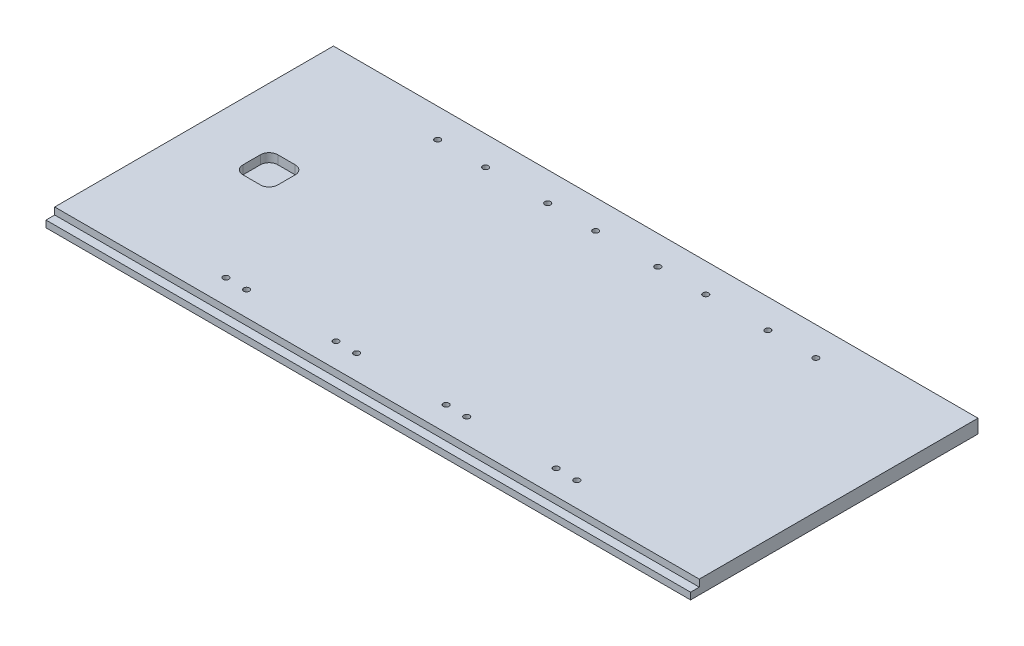
ISO-10303-21;
HEADER;
FILE_DESCRIPTION(('STEP AP214'),'2;1');
FILE_NAME('part.step','',(''),(''),'','','');
FILE_SCHEMA(('AUTOMOTIVE_DESIGN { 1 0 10303 214 1 1 1 1 }'));
ENDSEC;
DATA;
#1=APPLICATION_CONTEXT('core data for automotive mechanical design processes');
#2=APPLICATION_PROTOCOL_DEFINITION('international standard','automotive_design',2000,#1);
#3=PRODUCT_CONTEXT('',#1,'mechanical');
#4=PRODUCT('Part','Part','',(#3));
#5=PRODUCT_RELATED_PRODUCT_CATEGORY('part','',(#4));
#6=PRODUCT_DEFINITION_FORMATION('','',#4);
#7=PRODUCT_DEFINITION_CONTEXT('part definition',#1,'design');
#8=PRODUCT_DEFINITION('design','',#6,#7);
#9=PRODUCT_DEFINITION_SHAPE('','',#8);
#10=(LENGTH_UNIT() NAMED_UNIT(*) SI_UNIT(.MILLI.,.METRE.));
#11=(NAMED_UNIT(*) PLANE_ANGLE_UNIT() SI_UNIT($,.RADIAN.));
#12=(NAMED_UNIT(*) SI_UNIT($,.STERADIAN.) SOLID_ANGLE_UNIT());
#13=UNCERTAINTY_MEASURE_WITH_UNIT(LENGTH_MEASURE(1.E-05),#10,'distance_accuracy_value','');
#14=(GEOMETRIC_REPRESENTATION_CONTEXT(3) GLOBAL_UNCERTAINTY_ASSIGNED_CONTEXT((#13)) GLOBAL_UNIT_ASSIGNED_CONTEXT((#10,
#11,#12)) REPRESENTATION_CONTEXT('',''));
#15=CARTESIAN_POINT('',(0.,0.,0.));
#16=DIRECTION('',(0.,0.,1.));
#17=DIRECTION('',(1.,0.,0.));
#18=AXIS2_PLACEMENT_3D('',#15,#16,#17);
#19=CARTESIAN_POINT('',(-234.95,10.,104.775));
#20=DIRECTION('',(1.,0.,0.));
#21=DIRECTION('',(0.,0.,-1.));
#22=AXIS2_PLACEMENT_3D('',#19,#20,#21);
#23=PLANE('',#22);
#24=DIRECTION('',(0.,-1.,0.));
#25=VECTOR('',#24,1.);
#26=CARTESIAN_POINT('',(-234.95,10.,104.775));
#27=LINE('',#26,#25);
#28=CARTESIAN_POINT('',(-234.95,4.92,104.775));
#29=VERTEX_POINT('',#28);
#30=CARTESIAN_POINT('',(-234.95,0.,104.775));
#31=VERTEX_POINT('',#30);
#32=EDGE_CURVE('E191',#29,#31,#27,.T.);
#33=ORIENTED_EDGE('',*,*,#32,.F.);
#34=DIRECTION('',(0.,0.,1.));
#35=VECTOR('',#34,1.);
#36=CARTESIAN_POINT('',(-234.95,4.92,104.775));
#37=LINE('',#36,#35);
#38=CARTESIAN_POINT('',(-234.95,4.92,98.4250000000001));
#39=VERTEX_POINT('',#38);
#40=EDGE_CURVE('E152',#39,#29,#37,.T.);
#41=ORIENTED_EDGE('',*,*,#40,.F.);
#42=DIRECTION('',(0.,-1.,0.));
#43=VECTOR('',#42,1.);
#44=CARTESIAN_POINT('',(-234.95,10.,98.4250000000001));
#45=LINE('',#44,#43);
#46=CARTESIAN_POINT('',(-234.95,10.,98.4250000000001));
#47=VERTEX_POINT('',#46);
#48=EDGE_CURVE('E144',#47,#39,#45,.T.);
#49=ORIENTED_EDGE('',*,*,#48,.F.);
#50=DIRECTION('',(0.,0.,1.));
#51=VECTOR('',#50,1.);
#52=CARTESIAN_POINT('',(-234.95,10.,104.775));
#53=LINE('',#52,#51);
#54=CARTESIAN_POINT('',(-234.95,10.,-104.775));
#55=VERTEX_POINT('',#54);
#56=EDGE_CURVE('E158',#55,#47,#53,.T.);
#57=ORIENTED_EDGE('',*,*,#56,.F.);
#58=DIRECTION('',(0.,-1.,0.));
#59=VECTOR('',#58,1.);
#60=CARTESIAN_POINT('',(-234.95,10.,-104.775));
#61=LINE('',#60,#59);
#62=CARTESIAN_POINT('',(-234.95,0.,-104.775));
#63=VERTEX_POINT('',#62);
#64=EDGE_CURVE('E176',#55,#63,#61,.T.);
#65=ORIENTED_EDGE('',*,*,#64,.T.);
#66=DIRECTION('',(0.,0.,1.));
#67=VECTOR('',#66,1.);
#68=CARTESIAN_POINT('',(-234.95,0.,104.775));
#69=LINE('',#68,#67);
#70=EDGE_CURVE('E177',#63,#31,#69,.T.);
#71=ORIENTED_EDGE('',*,*,#70,.T.);
#72=EDGE_LOOP('',(#33,#41,#49,#57,#65,#71));
#73=FACE_BOUND('',#72,.T.);
#74=ADVANCED_FACE('F41',(#73),#23,.F.);
#75=CARTESIAN_POINT('',(234.95,10.,104.775));
#76=DIRECTION('',(0.,0.,-1.));
#77=DIRECTION('',(-1.,0.,0.));
#78=AXIS2_PLACEMENT_3D('',#75,#76,#77);
#79=PLANE('',#78);
#80=DIRECTION('',(0.,-1.,0.));
#81=VECTOR('',#80,1.);
#82=CARTESIAN_POINT('',(234.95,10.,104.775));
#83=LINE('',#82,#81);
#84=CARTESIAN_POINT('',(234.95,4.92,104.775));
#85=VERTEX_POINT('',#84);
#86=CARTESIAN_POINT('',(234.95,0.,104.775));
#87=VERTEX_POINT('',#86);
#88=EDGE_CURVE('E189',#85,#87,#83,.T.);
#89=ORIENTED_EDGE('',*,*,#88,.F.);
#90=DIRECTION('',(-1.,0.,0.));
#91=VECTOR('',#90,1.);
#92=CARTESIAN_POINT('',(234.951,4.92,104.775));
#93=LINE('',#92,#91);
#94=EDGE_CURVE('E264',#85,#29,#93,.T.);
#95=ORIENTED_EDGE('',*,*,#94,.T.);
#96=ORIENTED_EDGE('',*,*,#32,.T.);
#97=DIRECTION('',(1.,0.,0.));
#98=VECTOR('',#97,1.);
#99=CARTESIAN_POINT('',(234.95,0.,104.775));
#100=LINE('',#99,#98);
#101=EDGE_CURVE('E180',#31,#87,#100,.T.);
#102=ORIENTED_EDGE('',*,*,#101,.T.);
#103=EDGE_LOOP('',(#89,#95,#96,#102));
#104=FACE_BOUND('',#103,.T.);
#105=ADVANCED_FACE('F378',(#104),#79,.F.);
#106=CARTESIAN_POINT('',(234.95,10.,104.775));
#107=DIRECTION('',(-1.,0.,0.));
#108=DIRECTION('',(0.,0.,1.));
#109=AXIS2_PLACEMENT_3D('',#106,#107,#108);
#110=PLANE('',#109);
#111=DIRECTION('',(0.,1.,0.));
#112=VECTOR('',#111,1.);
#113=CARTESIAN_POINT('',(234.95,10.,98.4250000000001));
#114=LINE('',#113,#112);
#115=CARTESIAN_POINT('',(234.95,4.92,98.4250000000001));
#116=VERTEX_POINT('',#115);
#117=CARTESIAN_POINT('',(234.95,10.,98.4250000000001));
#118=VERTEX_POINT('',#117);
#119=EDGE_CURVE('E147',#116,#118,#114,.T.);
#120=ORIENTED_EDGE('',*,*,#119,.F.);
#121=DIRECTION('',(0.,0.,-1.));
#122=VECTOR('',#121,1.);
#123=CARTESIAN_POINT('',(234.95,4.92,104.775));
#124=LINE('',#123,#122);
#125=EDGE_CURVE('E159',#85,#116,#124,.T.);
#126=ORIENTED_EDGE('',*,*,#125,.F.);
#127=ORIENTED_EDGE('',*,*,#88,.T.);
#128=DIRECTION('',(0.,0.,-1.));
#129=VECTOR('',#128,1.);
#130=CARTESIAN_POINT('',(234.95,0.,104.775));
#131=LINE('',#130,#129);
#132=CARTESIAN_POINT('',(234.95,0.,-104.775));
#133=VERTEX_POINT('',#132);
#134=EDGE_CURVE('E169',#87,#133,#131,.T.);
#135=ORIENTED_EDGE('',*,*,#134,.T.);
#136=DIRECTION('',(0.,-1.,0.));
#137=VECTOR('',#136,1.);
#138=CARTESIAN_POINT('',(234.95,10.,-104.775));
#139=LINE('',#138,#137);
#140=CARTESIAN_POINT('',(234.95,10.,-104.775));
#141=VERTEX_POINT('',#140);
#142=EDGE_CURVE('E186',#141,#133,#139,.T.);
#143=ORIENTED_EDGE('',*,*,#142,.F.);
#144=DIRECTION('',(0.,0.,-1.));
#145=VECTOR('',#144,1.);
#146=CARTESIAN_POINT('',(234.95,10.,104.775));
#147=LINE('',#146,#145);
#148=EDGE_CURVE('E165',#118,#141,#147,.T.);
#149=ORIENTED_EDGE('',*,*,#148,.F.);
#150=EDGE_LOOP('',(#120,#126,#127,#135,#143,#149));
#151=FACE_BOUND('',#150,.T.);
#152=ADVANCED_FACE('F373',(#151),#110,.F.);
#153=CARTESIAN_POINT('',(234.95,10.,-104.775));
#154=DIRECTION('',(0.,0.,1.));
#155=DIRECTION('',(1.,0.,0.));
#156=AXIS2_PLACEMENT_3D('',#153,#154,#155);
#157=PLANE('',#156);
#158=DIRECTION('',(-1.,0.,0.));
#159=VECTOR('',#158,1.);
#160=CARTESIAN_POINT('',(234.95,0.,-104.775));
#161=LINE('',#160,#159);
#162=EDGE_CURVE('E166',#133,#63,#161,.T.);
#163=ORIENTED_EDGE('',*,*,#162,.T.);
#164=ORIENTED_EDGE('',*,*,#64,.F.);
#165=DIRECTION('',(-1.,0.,0.));
#166=VECTOR('',#165,1.);
#167=CARTESIAN_POINT('',(234.95,10.,-104.775));
#168=LINE('',#167,#166);
#169=EDGE_CURVE('E163',#141,#55,#168,.T.);
#170=ORIENTED_EDGE('',*,*,#169,.F.);
#171=ORIENTED_EDGE('',*,*,#142,.T.);
#172=EDGE_LOOP('',(#163,#164,#170,#171));
#173=FACE_BOUND('',#172,.T.);
#174=ADVANCED_FACE('F363',(#173),#157,.F.);
#175=CARTESIAN_POINT('',(0.,10.,0.));
#176=DIRECTION('',(0.,1.,0.));
#177=DIRECTION('',(0.,0.,1.));
#178=AXIS2_PLACEMENT_3D('',#175,#176,#177);
#179=PLANE('',#178);
#180=DIRECTION('',(-1.,0.,0.));
#181=VECTOR('',#180,1.);
#182=CARTESIAN_POINT('',(234.951,10.,98.4250000000001));
#183=LINE('',#182,#181);
#184=EDGE_CURVE('E141',#118,#47,#183,.T.);
#185=ORIENTED_EDGE('',*,*,#184,.F.);
#186=ORIENTED_EDGE('',*,*,#148,.T.);
#187=ORIENTED_EDGE('',*,*,#169,.T.);
#188=ORIENTED_EDGE('',*,*,#56,.T.);
#189=EDGE_LOOP('',(#185,#186,#187,#188));
#190=FACE_BOUND('',#189,.T.);
#191=DIRECTION('',(0.,0.,-1.));
#192=VECTOR('',#191,1.);
#193=CARTESIAN_POINT('',(-167.55,10.,-15.8749999999999));
#194=LINE('',#193,#192);
#195=CARTESIAN_POINT('',(-167.55,10.,3.17500000000006));
#196=VERTEX_POINT('',#195);
#197=CARTESIAN_POINT('',(-167.55,10.,-9.52499999999994));
#198=VERTEX_POINT('',#197);
#199=EDGE_CURVE('E261',#196,#198,#194,.T.);
#200=ORIENTED_EDGE('',*,*,#199,.F.);
#201=CARTESIAN_POINT('',(-173.9,10.,3.17500000000006));
#202=DIRECTION('',(0.,1.,0.));
#203=DIRECTION('',(0.,0.,1.));
#204=AXIS2_PLACEMENT_3D('',#201,#202,#203);
#205=CIRCLE('',#204,6.35);
#206=CARTESIAN_POINT('',(-173.9,10.,9.52500000000006));
#207=VERTEX_POINT('',#206);
#208=EDGE_CURVE('E220',#196,#207,#205,.F.);
#209=ORIENTED_EDGE('',*,*,#208,.T.);
#210=DIRECTION('',(1.,0.,0.));
#211=VECTOR('',#210,1.);
#212=CARTESIAN_POINT('',(-192.95,10.,9.52500000000006));
#213=LINE('',#212,#211);
#214=CARTESIAN_POINT('',(-186.6,10.,9.52500000000006));
#215=VERTEX_POINT('',#214);
#216=EDGE_CURVE('E229',#215,#207,#213,.T.);
#217=ORIENTED_EDGE('',*,*,#216,.F.);
#218=CARTESIAN_POINT('',(-186.6,10.,3.17500000000006));
#219=DIRECTION('',(0.,1.,0.));
#220=DIRECTION('',(0.,0.,1.));
#221=AXIS2_PLACEMENT_3D('',#218,#219,#220);
#222=CIRCLE('',#221,6.35);
#223=CARTESIAN_POINT('',(-192.95,10.,3.17500000000006));
#224=VERTEX_POINT('',#223);
#225=EDGE_CURVE('E222',#215,#224,#222,.F.);
#226=ORIENTED_EDGE('',*,*,#225,.T.);
#227=DIRECTION('',(0.,0.,1.));
#228=VECTOR('',#227,1.);
#229=CARTESIAN_POINT('',(-192.95,10.,-15.8749999999999));
#230=LINE('',#229,#228);
#231=CARTESIAN_POINT('',(-192.95,10.,-9.52499999999994));
#232=VERTEX_POINT('',#231);
#233=EDGE_CURVE('E227',#232,#224,#230,.T.);
#234=ORIENTED_EDGE('',*,*,#233,.F.);
#235=CARTESIAN_POINT('',(-186.6,10.,-9.52499999999994));
#236=DIRECTION('',(0.,1.,0.));
#237=DIRECTION('',(0.,0.,1.));
#238=AXIS2_PLACEMENT_3D('',#235,#236,#237);
#239=CIRCLE('',#238,6.35);
#240=CARTESIAN_POINT('',(-186.6,10.,-15.8749999999999));
#241=VERTEX_POINT('',#240);
#242=EDGE_CURVE('E49',#232,#241,#239,.F.);
#243=ORIENTED_EDGE('',*,*,#242,.T.);
#244=DIRECTION('',(-1.,0.,0.));
#245=VECTOR('',#244,1.);
#246=CARTESIAN_POINT('',(-192.95,10.,-15.8749999999999));
#247=LINE('',#246,#245);
#248=CARTESIAN_POINT('',(-173.9,10.,-15.8749999999999));
#249=VERTEX_POINT('',#248);
#250=EDGE_CURVE('E238',#249,#241,#247,.T.);
#251=ORIENTED_EDGE('',*,*,#250,.F.);
#252=CARTESIAN_POINT('',(-173.9,10.,-9.52499999999994));
#253=DIRECTION('',(0.,1.,0.));
#254=DIRECTION('',(0.,0.,1.));
#255=AXIS2_PLACEMENT_3D('',#252,#253,#254);
#256=CIRCLE('',#255,6.35);
#257=EDGE_CURVE('E11',#249,#198,#256,.F.);
#258=ORIENTED_EDGE('',*,*,#257,.T.);
#259=EDGE_LOOP('',(#200,#209,#217,#226,#234,#243,#251,#258));
#260=FACE_BOUND('',#259,.T.);
#261=CARTESIAN_POINT('',(-137.85,10.,-83.65));
#262=DIRECTION('',(0.,1.,0.));
#263=DIRECTION('',(0.,0.,1.));
#264=AXIS2_PLACEMENT_3D('',#261,#262,#263);
#265=CIRCLE('',#264,2.09999999999999);
#266=CARTESIAN_POINT('',(-137.85,10.,-81.55));
#267=VERTEX_POINT('',#266);
#268=EDGE_CURVE('E272',#267,#267,#265,.T.);
#269=ORIENTED_EDGE('',*,*,#268,.F.);
#270=EDGE_LOOP('',(#269));
#271=FACE_BOUND('',#270,.T.);
#272=CARTESIAN_POINT('',(127.9,10.,80.65));
#273=DIRECTION('',(0.,1.,0.));
#274=DIRECTION('',(0.,0.,1.));
#275=AXIS2_PLACEMENT_3D('',#272,#273,#274);
#276=CIRCLE('',#275,2.09999999999999);
#277=CARTESIAN_POINT('',(127.9,10.,82.75));
#278=VERTEX_POINT('',#277);
#279=EDGE_CURVE('E255',#278,#278,#276,.T.);
#280=ORIENTED_EDGE('',*,*,#279,.F.);
#281=EDGE_LOOP('',(#280));
#282=FACE_BOUND('',#281,.T.);
#283=CARTESIAN_POINT('',(47.65,10.,80.65));
#284=DIRECTION('',(0.,1.,0.));
#285=DIRECTION('',(0.,0.,1.));
#286=AXIS2_PLACEMENT_3D('',#283,#284,#285);
#287=CIRCLE('',#286,2.1);
#288=CARTESIAN_POINT('',(47.65,10.,82.75));
#289=VERTEX_POINT('',#288);
#290=EDGE_CURVE('E283',#289,#289,#287,.T.);
#291=ORIENTED_EDGE('',*,*,#290,.F.);
#292=EDGE_LOOP('',(#291));
#293=FACE_BOUND('',#292,.T.);
#294=CARTESIAN_POINT('',(-32.6,10.,80.65));
#295=DIRECTION('',(0.,1.,0.));
#296=DIRECTION('',(0.,0.,1.));
#297=AXIS2_PLACEMENT_3D('',#294,#295,#296);
#298=CIRCLE('',#297,2.1);
#299=CARTESIAN_POINT('',(-32.6,10.,82.75));
#300=VERTEX_POINT('',#299);
#301=EDGE_CURVE('E276',#300,#300,#298,.T.);
#302=ORIENTED_EDGE('',*,*,#301,.F.);
#303=EDGE_LOOP('',(#302));
#304=FACE_BOUND('',#303,.T.);
#305=CARTESIAN_POINT('',(-57.6,10.,-83.65));
#306=DIRECTION('',(0.,1.,0.));
#307=DIRECTION('',(0.,0.,1.));
#308=AXIS2_PLACEMENT_3D('',#305,#306,#307);
#309=CIRCLE('',#308,2.1);
#310=CARTESIAN_POINT('',(-57.6,10.,-81.55));
#311=VERTEX_POINT('',#310);
#312=EDGE_CURVE('E275',#311,#311,#309,.T.);
#313=ORIENTED_EDGE('',*,*,#312,.F.);
#314=EDGE_LOOP('',(#313));
#315=FACE_BOUND('',#314,.T.);
#316=CARTESIAN_POINT('',(22.65,10.,-83.65));
#317=DIRECTION('',(0.,1.,0.));
#318=DIRECTION('',(0.,0.,1.));
#319=AXIS2_PLACEMENT_3D('',#316,#317,#318);
#320=CIRCLE('',#319,2.1);
#321=CARTESIAN_POINT('',(22.65,10.,-81.55));
#322=VERTEX_POINT('',#321);
#323=EDGE_CURVE('E308',#322,#322,#320,.T.);
#324=ORIENTED_EDGE('',*,*,#323,.F.);
#325=EDGE_LOOP('',(#324));
#326=FACE_BOUND('',#325,.T.);
#327=CARTESIAN_POINT('',(102.9,10.,-83.65));
#328=DIRECTION('',(0.,1.,0.));
#329=DIRECTION('',(0.,0.,1.));
#330=AXIS2_PLACEMENT_3D('',#327,#328,#329);
#331=CIRCLE('',#330,2.1);
#332=CARTESIAN_POINT('',(102.9,10.,-81.55));
#333=VERTEX_POINT('',#332);
#334=EDGE_CURVE('E291',#333,#333,#331,.T.);
#335=ORIENTED_EDGE('',*,*,#334,.F.);
#336=EDGE_LOOP('',(#335));
#337=FACE_BOUND('',#336,.T.);
#338=CARTESIAN_POINT('',(-112.85,10.,80.65));
#339=DIRECTION('',(0.,1.,0.));
#340=DIRECTION('',(0.,0.,1.));
#341=AXIS2_PLACEMENT_3D('',#338,#339,#340);
#342=CIRCLE('',#341,2.1);
#343=CARTESIAN_POINT('',(-112.85,10.,82.75));
#344=VERTEX_POINT('',#343);
#345=EDGE_CURVE('E298',#344,#344,#342,.T.);
#346=ORIENTED_EDGE('',*,*,#345,.F.);
#347=EDGE_LOOP('',(#346));
#348=FACE_BOUND('',#347,.T.);
#349=CARTESIAN_POINT('',(-127.9,10.,80.65));
#350=DIRECTION('',(0.,1.,0.));
#351=DIRECTION('',(0.,0.,1.));
#352=AXIS2_PLACEMENT_3D('',#349,#350,#351);
#353=CIRCLE('',#352,2.09999999999999);
#354=CARTESIAN_POINT('',(-127.9,10.,82.75));
#355=VERTEX_POINT('',#354);
#356=EDGE_CURVE('E338',#355,#355,#353,.T.);
#357=ORIENTED_EDGE('',*,*,#356,.F.);
#358=EDGE_LOOP('',(#357));
#359=FACE_BOUND('',#358,.T.);
#360=CARTESIAN_POINT('',(137.85,10.,-83.65));
#361=DIRECTION('',(0.,1.,0.));
#362=DIRECTION('',(0.,0.,1.));
#363=AXIS2_PLACEMENT_3D('',#360,#361,#362);
#364=CIRCLE('',#363,2.09999999999999);
#365=CARTESIAN_POINT('',(137.85,10.,-81.55));
#366=VERTEX_POINT('',#365);
#367=EDGE_CURVE('E331',#366,#366,#364,.T.);
#368=ORIENTED_EDGE('',*,*,#367,.F.);
#369=EDGE_LOOP('',(#368));
#370=FACE_BOUND('',#369,.T.);
#371=CARTESIAN_POINT('',(57.6,10.,-83.65));
#372=DIRECTION('',(0.,1.,0.));
#373=DIRECTION('',(0.,0.,1.));
#374=AXIS2_PLACEMENT_3D('',#371,#372,#373);
#375=CIRCLE('',#374,2.1);
#376=CARTESIAN_POINT('',(57.6,10.,-81.55));
#377=VERTEX_POINT('',#376);
#378=EDGE_CURVE('E349',#377,#377,#375,.T.);
#379=ORIENTED_EDGE('',*,*,#378,.F.);
#380=EDGE_LOOP('',(#379));
#381=FACE_BOUND('',#380,.T.);
#382=CARTESIAN_POINT('',(-22.65,10.,-83.65));
#383=DIRECTION('',(0.,1.,0.));
#384=DIRECTION('',(0.,0.,1.));
#385=AXIS2_PLACEMENT_3D('',#382,#383,#384);
#386=CIRCLE('',#385,2.1);
#387=CARTESIAN_POINT('',(-22.65,10.,-81.55));
#388=VERTEX_POINT('',#387);
#389=EDGE_CURVE('E343',#388,#388,#386,.T.);
#390=ORIENTED_EDGE('',*,*,#389,.F.);
#391=EDGE_LOOP('',(#390));
#392=FACE_BOUND('',#391,.T.);
#393=CARTESIAN_POINT('',(-47.65,10.,80.65));
#394=DIRECTION('',(0.,1.,0.));
#395=DIRECTION('',(0.,0.,1.));
#396=AXIS2_PLACEMENT_3D('',#393,#394,#395);
#397=CIRCLE('',#396,2.1);
#398=CARTESIAN_POINT('',(-47.65,10.,82.75));
#399=VERTEX_POINT('',#398);
#400=EDGE_CURVE('E313',#399,#399,#397,.T.);
#401=ORIENTED_EDGE('',*,*,#400,.F.);
#402=EDGE_LOOP('',(#401));
#403=FACE_BOUND('',#402,.T.);
#404=CARTESIAN_POINT('',(32.6,10.,80.65));
#405=DIRECTION('',(0.,1.,0.));
#406=DIRECTION('',(0.,0.,1.));
#407=AXIS2_PLACEMENT_3D('',#404,#405,#406);
#408=CIRCLE('',#407,2.1);
#409=CARTESIAN_POINT('',(32.6,10.,82.75));
#410=VERTEX_POINT('',#409);
#411=EDGE_CURVE('E320',#410,#410,#408,.T.);
#412=ORIENTED_EDGE('',*,*,#411,.F.);
#413=EDGE_LOOP('',(#412));
#414=FACE_BOUND('',#413,.T.);
#415=CARTESIAN_POINT('',(112.85,10.,80.65));
#416=DIRECTION('',(0.,1.,0.));
#417=DIRECTION('',(0.,0.,1.));
#418=AXIS2_PLACEMENT_3D('',#415,#416,#417);
#419=CIRCLE('',#418,2.1);
#420=CARTESIAN_POINT('',(112.85,10.,82.75));
#421=VERTEX_POINT('',#420);
#422=EDGE_CURVE('E326',#421,#421,#419,.T.);
#423=ORIENTED_EDGE('',*,*,#422,.F.);
#424=EDGE_LOOP('',(#423));
#425=FACE_BOUND('',#424,.T.);
#426=CARTESIAN_POINT('',(-102.9,10.,-83.65));
#427=DIRECTION('',(0.,1.,0.));
#428=DIRECTION('',(0.,0.,1.));
#429=AXIS2_PLACEMENT_3D('',#426,#427,#428);
#430=CIRCLE('',#429,2.1);
#431=CARTESIAN_POINT('',(-102.9,10.,-81.55));
#432=VERTEX_POINT('',#431);
#433=EDGE_CURVE('E172',#432,#432,#430,.T.);
#434=ORIENTED_EDGE('',*,*,#433,.F.);
#435=EDGE_LOOP('',(#434));
#436=FACE_BOUND('',#435,.T.);
#437=ADVANCED_FACE('F161',(#190,#260,#271,#282,#293,#304,#315,#326,#337,#348,#359,#370,#381,
#392,#403,#414,#425,#436),#179,.T.);
#438=CARTESIAN_POINT('',(0.,0.,0.));
#439=DIRECTION('',(0.,1.,0.));
#440=DIRECTION('',(0.,0.,1.));
#441=AXIS2_PLACEMENT_3D('',#438,#439,#440);
#442=PLANE('',#441);
#443=CARTESIAN_POINT('',(-137.85,0.,-83.65));
#444=DIRECTION('',(0.,1.,0.));
#445=DIRECTION('',(0.,0.,1.));
#446=AXIS2_PLACEMENT_3D('',#443,#444,#445);
#447=CIRCLE('',#446,2.09999999999999);
#448=CARTESIAN_POINT('',(-137.85,0.,-81.55));
#449=VERTEX_POINT('',#448);
#450=EDGE_CURVE('E268',#449,#449,#447,.T.);
#451=ORIENTED_EDGE('',*,*,#450,.T.);
#452=EDGE_LOOP('',(#451));
#453=FACE_BOUND('',#452,.T.);
#454=CARTESIAN_POINT('',(127.9,0.,80.65));
#455=DIRECTION('',(0.,1.,0.));
#456=DIRECTION('',(0.,0.,1.));
#457=AXIS2_PLACEMENT_3D('',#454,#455,#456);
#458=CIRCLE('',#457,2.09999999999999);
#459=CARTESIAN_POINT('',(127.9,0.,82.75));
#460=VERTEX_POINT('',#459);
#461=EDGE_CURVE('E252',#460,#460,#458,.T.);
#462=ORIENTED_EDGE('',*,*,#461,.T.);
#463=EDGE_LOOP('',(#462));
#464=FACE_BOUND('',#463,.T.);
#465=CARTESIAN_POINT('',(47.65,0.,80.65));
#466=DIRECTION('',(0.,1.,0.));
#467=DIRECTION('',(0.,0.,1.));
#468=AXIS2_PLACEMENT_3D('',#465,#466,#467);
#469=CIRCLE('',#468,2.1);
#470=CARTESIAN_POINT('',(47.65,0.,82.75));
#471=VERTEX_POINT('',#470);
#472=EDGE_CURVE('E286',#471,#471,#469,.T.);
#473=ORIENTED_EDGE('',*,*,#472,.T.);
#474=EDGE_LOOP('',(#473));
#475=FACE_BOUND('',#474,.T.);
#476=CARTESIAN_POINT('',(-32.6,0.,80.65));
#477=DIRECTION('',(0.,1.,0.));
#478=DIRECTION('',(0.,0.,1.));
#479=AXIS2_PLACEMENT_3D('',#476,#477,#478);
#480=CIRCLE('',#479,2.1);
#481=CARTESIAN_POINT('',(-32.6,0.,82.75));
#482=VERTEX_POINT('',#481);
#483=EDGE_CURVE('E280',#482,#482,#480,.T.);
#484=ORIENTED_EDGE('',*,*,#483,.T.);
#485=EDGE_LOOP('',(#484));
#486=FACE_BOUND('',#485,.T.);
#487=CARTESIAN_POINT('',(-57.6,0.,-83.65));
#488=DIRECTION('',(0.,1.,0.));
#489=DIRECTION('',(0.,0.,1.));
#490=AXIS2_PLACEMENT_3D('',#487,#488,#489);
#491=CIRCLE('',#490,2.1);
#492=CARTESIAN_POINT('',(-57.6,0.,-81.55));
#493=VERTEX_POINT('',#492);
#494=EDGE_CURVE('E305',#493,#493,#491,.T.);
#495=ORIENTED_EDGE('',*,*,#494,.T.);
#496=EDGE_LOOP('',(#495));
#497=FACE_BOUND('',#496,.T.);
#498=CARTESIAN_POINT('',(22.65,0.,-83.65));
#499=DIRECTION('',(0.,1.,0.));
#500=DIRECTION('',(0.,0.,1.));
#501=AXIS2_PLACEMENT_3D('',#498,#499,#500);
#502=CIRCLE('',#501,2.1);
#503=CARTESIAN_POINT('',(22.65,0.,-81.55));
#504=VERTEX_POINT('',#503);
#505=EDGE_CURVE('E294',#504,#504,#502,.T.);
#506=ORIENTED_EDGE('',*,*,#505,.T.);
#507=EDGE_LOOP('',(#506));
#508=FACE_BOUND('',#507,.T.);
#509=CARTESIAN_POINT('',(102.9,0.,-83.65));
#510=DIRECTION('',(0.,1.,0.));
#511=DIRECTION('',(0.,0.,1.));
#512=AXIS2_PLACEMENT_3D('',#509,#510,#511);
#513=CIRCLE('',#512,2.1);
#514=CARTESIAN_POINT('',(102.9,0.,-81.55));
#515=VERTEX_POINT('',#514);
#516=EDGE_CURVE('E295',#515,#515,#513,.T.);
#517=ORIENTED_EDGE('',*,*,#516,.T.);
#518=EDGE_LOOP('',(#517));
#519=FACE_BOUND('',#518,.T.);
#520=CARTESIAN_POINT('',(-112.85,0.,80.65));
#521=DIRECTION('',(0.,1.,0.));
#522=DIRECTION('',(0.,0.,1.));
#523=AXIS2_PLACEMENT_3D('',#520,#521,#522);
#524=CIRCLE('',#523,2.1);
#525=CARTESIAN_POINT('',(-112.85,0.,82.75));
#526=VERTEX_POINT('',#525);
#527=EDGE_CURVE('E279',#526,#526,#524,.T.);
#528=ORIENTED_EDGE('',*,*,#527,.T.);
#529=EDGE_LOOP('',(#528));
#530=FACE_BOUND('',#529,.T.);
#531=CARTESIAN_POINT('',(-127.9,0.,80.65));
#532=DIRECTION('',(0.,1.,0.));
#533=DIRECTION('',(0.,0.,1.));
#534=AXIS2_PLACEMENT_3D('',#531,#532,#533);
#535=CIRCLE('',#534,2.09999999999999);
#536=CARTESIAN_POINT('',(-127.9,0.,82.75));
#537=VERTEX_POINT('',#536);
#538=EDGE_CURVE('E316',#537,#537,#535,.T.);
#539=ORIENTED_EDGE('',*,*,#538,.T.);
#540=EDGE_LOOP('',(#539));
#541=FACE_BOUND('',#540,.T.);
#542=CARTESIAN_POINT('',(137.85,0.,-83.65));
#543=DIRECTION('',(0.,1.,0.));
#544=DIRECTION('',(0.,0.,1.));
#545=AXIS2_PLACEMENT_3D('',#542,#543,#544);
#546=CIRCLE('',#545,2.09999999999999);
#547=CARTESIAN_POINT('',(137.85,0.,-81.55));
#548=VERTEX_POINT('',#547);
#549=EDGE_CURVE('E335',#548,#548,#546,.T.);
#550=ORIENTED_EDGE('',*,*,#549,.T.);
#551=EDGE_LOOP('',(#550));
#552=FACE_BOUND('',#551,.T.);
#553=CARTESIAN_POINT('',(57.6,0.,-83.65));
#554=DIRECTION('',(0.,1.,0.));
#555=DIRECTION('',(0.,0.,1.));
#556=AXIS2_PLACEMENT_3D('',#553,#554,#555);
#557=CIRCLE('',#556,2.1);
#558=CARTESIAN_POINT('',(57.6,0.,-81.55));
#559=VERTEX_POINT('',#558);
#560=EDGE_CURVE('E334',#559,#559,#557,.T.);
#561=ORIENTED_EDGE('',*,*,#560,.T.);
#562=EDGE_LOOP('',(#561));
#563=FACE_BOUND('',#562,.T.);
#564=CARTESIAN_POINT('',(-22.65,0.,-83.65));
#565=DIRECTION('',(0.,1.,0.));
#566=DIRECTION('',(0.,0.,1.));
#567=AXIS2_PLACEMENT_3D('',#564,#565,#566);
#568=CIRCLE('',#567,2.1);
#569=CARTESIAN_POINT('',(-22.65,0.,-81.55));
#570=VERTEX_POINT('',#569);
#571=EDGE_CURVE('E346',#570,#570,#568,.T.);
#572=ORIENTED_EDGE('',*,*,#571,.T.);
#573=EDGE_LOOP('',(#572));
#574=FACE_BOUND('',#573,.T.);
#575=CARTESIAN_POINT('',(-47.65,0.,80.65));
#576=DIRECTION('',(0.,1.,0.));
#577=DIRECTION('',(0.,0.,1.));
#578=AXIS2_PLACEMENT_3D('',#575,#576,#577);
#579=CIRCLE('',#578,2.1);
#580=CARTESIAN_POINT('',(-47.65,0.,82.75));
#581=VERTEX_POINT('',#580);
#582=EDGE_CURVE('E317',#581,#581,#579,.T.);
#583=ORIENTED_EDGE('',*,*,#582,.T.);
#584=EDGE_LOOP('',(#583));
#585=FACE_BOUND('',#584,.T.);
#586=CARTESIAN_POINT('',(32.6,0.,80.65));
#587=DIRECTION('',(0.,1.,0.));
#588=DIRECTION('',(0.,0.,1.));
#589=AXIS2_PLACEMENT_3D('',#586,#587,#588);
#590=CIRCLE('',#589,2.1);
#591=CARTESIAN_POINT('',(32.6,0.,82.75));
#592=VERTEX_POINT('',#591);
#593=EDGE_CURVE('E323',#592,#592,#590,.T.);
#594=ORIENTED_EDGE('',*,*,#593,.T.);
#595=EDGE_LOOP('',(#594));
#596=FACE_BOUND('',#595,.T.);
#597=CARTESIAN_POINT('',(112.85,0.,80.65));
#598=DIRECTION('',(0.,1.,0.));
#599=DIRECTION('',(0.,0.,1.));
#600=AXIS2_PLACEMENT_3D('',#597,#598,#599);
#601=CIRCLE('',#600,2.1);
#602=CARTESIAN_POINT('',(112.85,0.,82.75));
#603=VERTEX_POINT('',#602);
#604=EDGE_CURVE('E271',#603,#603,#601,.T.);
#605=ORIENTED_EDGE('',*,*,#604,.T.);
#606=EDGE_LOOP('',(#605));
#607=FACE_BOUND('',#606,.T.);
#608=CARTESIAN_POINT('',(-102.9,0.,-83.65));
#609=DIRECTION('',(0.,1.,0.));
#610=DIRECTION('',(0.,0.,1.));
#611=AXIS2_PLACEMENT_3D('',#608,#609,#610);
#612=CIRCLE('',#611,2.1);
#613=CARTESIAN_POINT('',(-102.9,0.,-81.55));
#614=VERTEX_POINT('',#613);
#615=EDGE_CURVE('E181',#614,#614,#612,.T.);
#616=ORIENTED_EDGE('',*,*,#615,.T.);
#617=EDGE_LOOP('',(#616));
#618=FACE_BOUND('',#617,.T.);
#619=ORIENTED_EDGE('',*,*,#70,.F.);
#620=ORIENTED_EDGE('',*,*,#162,.F.);
#621=ORIENTED_EDGE('',*,*,#134,.F.);
#622=ORIENTED_EDGE('',*,*,#101,.F.);
#623=EDGE_LOOP('',(#619,#620,#621,#622));
#624=FACE_BOUND('',#623,.T.);
#625=ADVANCED_FACE('F362',(#453,#464,#475,#486,#497,#508,#519,#530,#541,#552,#563,#574,#585,
#596,#607,#618,#624),#442,.F.);
#626=CARTESIAN_POINT('',(-102.9,0.,-83.65));
#627=DIRECTION('',(0.,1.,0.));
#628=DIRECTION('',(0.,0.,1.));
#629=AXIS2_PLACEMENT_3D('',#626,#627,#628);
#630=CYLINDRICAL_SURFACE('',#629,2.1);
#631=ORIENTED_EDGE('',*,*,#615,.F.);
#632=EDGE_LOOP('',(#631));
#633=FACE_BOUND('',#632,.T.);
#634=ORIENTED_EDGE('',*,*,#433,.T.);
#635=EDGE_LOOP('',(#634));
#636=FACE_BOUND('',#635,.T.);
#637=ADVANCED_FACE('F359',(#633,#636),#630,.F.);
#638=CARTESIAN_POINT('',(112.85,0.,80.65));
#639=DIRECTION('',(0.,1.,0.));
#640=DIRECTION('',(0.,0.,1.));
#641=AXIS2_PLACEMENT_3D('',#638,#639,#640);
#642=CYLINDRICAL_SURFACE('',#641,2.1);
#643=ORIENTED_EDGE('',*,*,#604,.F.);
#644=EDGE_LOOP('',(#643));
#645=FACE_BOUND('',#644,.T.);
#646=ORIENTED_EDGE('',*,*,#422,.T.);
#647=EDGE_LOOP('',(#646));
#648=FACE_BOUND('',#647,.T.);
#649=ADVANCED_FACE('F644',(#645,#648),#642,.F.);
#650=CARTESIAN_POINT('',(32.6,0.,80.65));
#651=DIRECTION('',(0.,1.,0.));
#652=DIRECTION('',(0.,0.,1.));
#653=AXIS2_PLACEMENT_3D('',#650,#651,#652);
#654=CYLINDRICAL_SURFACE('',#653,2.1);
#655=ORIENTED_EDGE('',*,*,#593,.F.);
#656=EDGE_LOOP('',(#655));
#657=FACE_BOUND('',#656,.T.);
#658=ORIENTED_EDGE('',*,*,#411,.T.);
#659=EDGE_LOOP('',(#658));
#660=FACE_BOUND('',#659,.T.);
#661=ADVANCED_FACE('F634',(#657,#660),#654,.F.);
#662=CARTESIAN_POINT('',(-47.65,0.,80.65));
#663=DIRECTION('',(0.,1.,0.));
#664=DIRECTION('',(0.,0.,1.));
#665=AXIS2_PLACEMENT_3D('',#662,#663,#664);
#666=CYLINDRICAL_SURFACE('',#665,2.1);
#667=ORIENTED_EDGE('',*,*,#582,.F.);
#668=EDGE_LOOP('',(#667));
#669=FACE_BOUND('',#668,.T.);
#670=ORIENTED_EDGE('',*,*,#400,.T.);
#671=EDGE_LOOP('',(#670));
#672=FACE_BOUND('',#671,.T.);
#673=ADVANCED_FACE('F624',(#669,#672),#666,.F.);
#674=CARTESIAN_POINT('',(-22.65,0.,-83.65));
#675=DIRECTION('',(0.,1.,0.));
#676=DIRECTION('',(0.,0.,1.));
#677=AXIS2_PLACEMENT_3D('',#674,#675,#676);
#678=CYLINDRICAL_SURFACE('',#677,2.1);
#679=ORIENTED_EDGE('',*,*,#571,.F.);
#680=EDGE_LOOP('',(#679));
#681=FACE_BOUND('',#680,.T.);
#682=ORIENTED_EDGE('',*,*,#389,.T.);
#683=EDGE_LOOP('',(#682));
#684=FACE_BOUND('',#683,.T.);
#685=ADVANCED_FACE('F614',(#681,#684),#678,.F.);
#686=CARTESIAN_POINT('',(57.6,0.,-83.65));
#687=DIRECTION('',(0.,1.,0.));
#688=DIRECTION('',(0.,0.,1.));
#689=AXIS2_PLACEMENT_3D('',#686,#687,#688);
#690=CYLINDRICAL_SURFACE('',#689,2.1);
#691=ORIENTED_EDGE('',*,*,#560,.F.);
#692=EDGE_LOOP('',(#691));
#693=FACE_BOUND('',#692,.T.);
#694=ORIENTED_EDGE('',*,*,#378,.T.);
#695=EDGE_LOOP('',(#694));
#696=FACE_BOUND('',#695,.T.);
#697=ADVANCED_FACE('F604',(#693,#696),#690,.F.);
#698=CARTESIAN_POINT('',(137.85,0.,-83.65));
#699=DIRECTION('',(0.,1.,0.));
#700=DIRECTION('',(0.,0.,1.));
#701=AXIS2_PLACEMENT_3D('',#698,#699,#700);
#702=CYLINDRICAL_SURFACE('',#701,2.09999999999999);
#703=ORIENTED_EDGE('',*,*,#549,.F.);
#704=EDGE_LOOP('',(#703));
#705=FACE_BOUND('',#704,.T.);
#706=ORIENTED_EDGE('',*,*,#367,.T.);
#707=EDGE_LOOP('',(#706));
#708=FACE_BOUND('',#707,.T.);
#709=ADVANCED_FACE('F594',(#705,#708),#702,.F.);
#710=CARTESIAN_POINT('',(-127.9,0.,80.65));
#711=DIRECTION('',(0.,1.,0.));
#712=DIRECTION('',(0.,0.,1.));
#713=AXIS2_PLACEMENT_3D('',#710,#711,#712);
#714=CYLINDRICAL_SURFACE('',#713,2.09999999999999);
#715=ORIENTED_EDGE('',*,*,#538,.F.);
#716=EDGE_LOOP('',(#715));
#717=FACE_BOUND('',#716,.T.);
#718=ORIENTED_EDGE('',*,*,#356,.T.);
#719=EDGE_LOOP('',(#718));
#720=FACE_BOUND('',#719,.T.);
#721=ADVANCED_FACE('F584',(#717,#720),#714,.F.);
#722=CARTESIAN_POINT('',(-112.85,0.,80.65));
#723=DIRECTION('',(0.,1.,0.));
#724=DIRECTION('',(0.,0.,1.));
#725=AXIS2_PLACEMENT_3D('',#722,#723,#724);
#726=CYLINDRICAL_SURFACE('',#725,2.1);
#727=ORIENTED_EDGE('',*,*,#527,.F.);
#728=EDGE_LOOP('',(#727));
#729=FACE_BOUND('',#728,.T.);
#730=ORIENTED_EDGE('',*,*,#345,.T.);
#731=EDGE_LOOP('',(#730));
#732=FACE_BOUND('',#731,.T.);
#733=ADVANCED_FACE('F574',(#729,#732),#726,.F.);
#734=CARTESIAN_POINT('',(102.9,0.,-83.65));
#735=DIRECTION('',(0.,1.,0.));
#736=DIRECTION('',(0.,0.,1.));
#737=AXIS2_PLACEMENT_3D('',#734,#735,#736);
#738=CYLINDRICAL_SURFACE('',#737,2.1);
#739=ORIENTED_EDGE('',*,*,#516,.F.);
#740=EDGE_LOOP('',(#739));
#741=FACE_BOUND('',#740,.T.);
#742=ORIENTED_EDGE('',*,*,#334,.T.);
#743=EDGE_LOOP('',(#742));
#744=FACE_BOUND('',#743,.T.);
#745=ADVANCED_FACE('F564',(#741,#744),#738,.F.);
#746=CARTESIAN_POINT('',(22.65,0.,-83.65));
#747=DIRECTION('',(0.,1.,0.));
#748=DIRECTION('',(0.,0.,1.));
#749=AXIS2_PLACEMENT_3D('',#746,#747,#748);
#750=CYLINDRICAL_SURFACE('',#749,2.1);
#751=ORIENTED_EDGE('',*,*,#505,.F.);
#752=EDGE_LOOP('',(#751));
#753=FACE_BOUND('',#752,.T.);
#754=ORIENTED_EDGE('',*,*,#323,.T.);
#755=EDGE_LOOP('',(#754));
#756=FACE_BOUND('',#755,.T.);
#757=ADVANCED_FACE('F554',(#753,#756),#750,.F.);
#758=CARTESIAN_POINT('',(-57.6,0.,-83.65));
#759=DIRECTION('',(0.,1.,0.));
#760=DIRECTION('',(0.,0.,1.));
#761=AXIS2_PLACEMENT_3D('',#758,#759,#760);
#762=CYLINDRICAL_SURFACE('',#761,2.1);
#763=ORIENTED_EDGE('',*,*,#494,.F.);
#764=EDGE_LOOP('',(#763));
#765=FACE_BOUND('',#764,.T.);
#766=ORIENTED_EDGE('',*,*,#312,.T.);
#767=EDGE_LOOP('',(#766));
#768=FACE_BOUND('',#767,.T.);
#769=ADVANCED_FACE('F544',(#765,#768),#762,.F.);
#770=CARTESIAN_POINT('',(-32.6,0.,80.65));
#771=DIRECTION('',(0.,1.,0.));
#772=DIRECTION('',(0.,0.,1.));
#773=AXIS2_PLACEMENT_3D('',#770,#771,#772);
#774=CYLINDRICAL_SURFACE('',#773,2.1);
#775=ORIENTED_EDGE('',*,*,#483,.F.);
#776=EDGE_LOOP('',(#775));
#777=FACE_BOUND('',#776,.T.);
#778=ORIENTED_EDGE('',*,*,#301,.T.);
#779=EDGE_LOOP('',(#778));
#780=FACE_BOUND('',#779,.T.);
#781=ADVANCED_FACE('F534',(#777,#780),#774,.F.);
#782=CARTESIAN_POINT('',(47.65,0.,80.65));
#783=DIRECTION('',(0.,1.,0.));
#784=DIRECTION('',(0.,0.,1.));
#785=AXIS2_PLACEMENT_3D('',#782,#783,#784);
#786=CYLINDRICAL_SURFACE('',#785,2.1);
#787=ORIENTED_EDGE('',*,*,#472,.F.);
#788=EDGE_LOOP('',(#787));
#789=FACE_BOUND('',#788,.T.);
#790=ORIENTED_EDGE('',*,*,#290,.T.);
#791=EDGE_LOOP('',(#790));
#792=FACE_BOUND('',#791,.T.);
#793=ADVANCED_FACE('F524',(#789,#792),#786,.F.);
#794=CARTESIAN_POINT('',(127.9,0.,80.65));
#795=DIRECTION('',(0.,1.,0.));
#796=DIRECTION('',(0.,0.,1.));
#797=AXIS2_PLACEMENT_3D('',#794,#795,#796);
#798=CYLINDRICAL_SURFACE('',#797,2.09999999999999);
#799=ORIENTED_EDGE('',*,*,#461,.F.);
#800=EDGE_LOOP('',(#799));
#801=FACE_BOUND('',#800,.T.);
#802=ORIENTED_EDGE('',*,*,#279,.T.);
#803=EDGE_LOOP('',(#802));
#804=FACE_BOUND('',#803,.T.);
#805=ADVANCED_FACE('F514',(#801,#804),#798,.F.);
#806=CARTESIAN_POINT('',(-137.85,0.,-83.65));
#807=DIRECTION('',(0.,1.,0.));
#808=DIRECTION('',(0.,0.,1.));
#809=AXIS2_PLACEMENT_3D('',#806,#807,#808);
#810=CYLINDRICAL_SURFACE('',#809,2.09999999999999);
#811=ORIENTED_EDGE('',*,*,#450,.F.);
#812=EDGE_LOOP('',(#811));
#813=FACE_BOUND('',#812,.T.);
#814=ORIENTED_EDGE('',*,*,#268,.T.);
#815=EDGE_LOOP('',(#814));
#816=FACE_BOUND('',#815,.T.);
#817=ADVANCED_FACE('F502',(#813,#816),#810,.F.);
#818=CARTESIAN_POINT('',(-167.55,3.65,-15.8749999999999));
#819=DIRECTION('',(1.,0.,0.));
#820=DIRECTION('',(0.,0.,-1.));
#821=AXIS2_PLACEMENT_3D('',#818,#819,#820);
#822=PLANE('',#821);
#823=DIRECTION('',(0.,0.,-1.));
#824=VECTOR('',#823,1.);
#825=CARTESIAN_POINT('',(-167.55,3.65,-15.8749999999999));
#826=LINE('',#825,#824);
#827=CARTESIAN_POINT('',(-167.55,3.65,3.17500000000006));
#828=VERTEX_POINT('',#827);
#829=CARTESIAN_POINT('',(-167.55,3.65,-9.52499999999994));
#830=VERTEX_POINT('',#829);
#831=EDGE_CURVE('E267',#828,#830,#826,.T.);
#832=ORIENTED_EDGE('',*,*,#831,.F.);
#833=DIRECTION('',(0.,1.,0.));
#834=VECTOR('',#833,1.);
#835=CARTESIAN_POINT('',(-167.55,10.,3.17500000000006));
#836=LINE('',#835,#834);
#837=EDGE_CURVE('E195',#828,#196,#836,.T.);
#838=ORIENTED_EDGE('',*,*,#837,.T.);
#839=ORIENTED_EDGE('',*,*,#199,.T.);
#840=DIRECTION('',(0.,1.,0.));
#841=VECTOR('',#840,1.);
#842=CARTESIAN_POINT('',(-167.55,3.65,-9.52499999999994));
#843=LINE('',#842,#841);
#844=EDGE_CURVE('E193',#198,#830,#843,.F.);
#845=ORIENTED_EDGE('',*,*,#844,.T.);
#846=EDGE_LOOP('',(#832,#838,#839,#845));
#847=FACE_BOUND('',#846,.T.);
#848=ADVANCED_FACE('F495',(#847),#822,.F.);
#849=CARTESIAN_POINT('',(-192.95,3.65,9.52500000000006));
#850=DIRECTION('',(0.,0.,1.));
#851=DIRECTION('',(1.,0.,0.));
#852=AXIS2_PLACEMENT_3D('',#849,#850,#851);
#853=PLANE('',#852);
#854=ORIENTED_EDGE('',*,*,#216,.T.);
#855=DIRECTION('',(0.,1.,0.));
#856=VECTOR('',#855,1.);
#857=CARTESIAN_POINT('',(-173.9,3.65,9.52500000000006));
#858=LINE('',#857,#856);
#859=CARTESIAN_POINT('',(-173.9,3.65,9.52500000000006));
#860=VERTEX_POINT('',#859);
#861=EDGE_CURVE('E201',#207,#860,#858,.F.);
#862=ORIENTED_EDGE('',*,*,#861,.T.);
#863=DIRECTION('',(1.,0.,0.));
#864=VECTOR('',#863,1.);
#865=CARTESIAN_POINT('',(-192.95,3.65,9.52500000000006));
#866=LINE('',#865,#864);
#867=CARTESIAN_POINT('',(-186.6,3.65,9.52500000000006));
#868=VERTEX_POINT('',#867);
#869=EDGE_CURVE('E246',#868,#860,#866,.T.);
#870=ORIENTED_EDGE('',*,*,#869,.F.);
#871=DIRECTION('',(0.,1.,0.));
#872=VECTOR('',#871,1.);
#873=CARTESIAN_POINT('',(-186.6,10.,9.52500000000006));
#874=LINE('',#873,#872);
#875=EDGE_CURVE('E198',#868,#215,#874,.T.);
#876=ORIENTED_EDGE('',*,*,#875,.T.);
#877=EDGE_LOOP('',(#854,#862,#870,#876));
#878=FACE_BOUND('',#877,.T.);
#879=ADVANCED_FACE('F250',(#878),#853,.F.);
#880=CARTESIAN_POINT('',(-192.95,3.65,-15.8749999999999));
#881=DIRECTION('',(-1.,0.,0.));
#882=DIRECTION('',(0.,0.,1.));
#883=AXIS2_PLACEMENT_3D('',#880,#881,#882);
#884=PLANE('',#883);
#885=ORIENTED_EDGE('',*,*,#233,.T.);
#886=DIRECTION('',(0.,1.,0.));
#887=VECTOR('',#886,1.);
#888=CARTESIAN_POINT('',(-192.95,3.65,3.17500000000006));
#889=LINE('',#888,#887);
#890=CARTESIAN_POINT('',(-192.95,3.65,3.17500000000006));
#891=VERTEX_POINT('',#890);
#892=EDGE_CURVE('E214',#224,#891,#889,.F.);
#893=ORIENTED_EDGE('',*,*,#892,.T.);
#894=DIRECTION('',(0.,0.,1.));
#895=VECTOR('',#894,1.);
#896=CARTESIAN_POINT('',(-192.95,3.65,-15.8749999999999));
#897=LINE('',#896,#895);
#898=CARTESIAN_POINT('',(-192.95,3.65,-9.52499999999994));
#899=VERTEX_POINT('',#898);
#900=EDGE_CURVE('E248',#899,#891,#897,.T.);
#901=ORIENTED_EDGE('',*,*,#900,.F.);
#902=DIRECTION('',(0.,1.,0.));
#903=VECTOR('',#902,1.);
#904=CARTESIAN_POINT('',(-192.95,10.,-9.52499999999994));
#905=LINE('',#904,#903);
#906=EDGE_CURVE('E211',#899,#232,#905,.T.);
#907=ORIENTED_EDGE('',*,*,#906,.T.);
#908=EDGE_LOOP('',(#885,#893,#901,#907));
#909=FACE_BOUND('',#908,.T.);
#910=ADVANCED_FACE('F234',(#909),#884,.F.);
#911=CARTESIAN_POINT('',(-192.95,3.65,-15.8749999999999));
#912=DIRECTION('',(0.,0.,-1.));
#913=DIRECTION('',(-1.,0.,0.));
#914=AXIS2_PLACEMENT_3D('',#911,#912,#913);
#915=PLANE('',#914);
#916=ORIENTED_EDGE('',*,*,#250,.T.);
#917=DIRECTION('',(0.,1.,0.));
#918=VECTOR('',#917,1.);
#919=CARTESIAN_POINT('',(-186.6,3.65,-15.8749999999999));
#920=LINE('',#919,#918);
#921=CARTESIAN_POINT('',(-186.6,3.65,-15.8749999999999));
#922=VERTEX_POINT('',#921);
#923=EDGE_CURVE('E218',#241,#922,#920,.F.);
#924=ORIENTED_EDGE('',*,*,#923,.T.);
#925=DIRECTION('',(-1.,0.,0.));
#926=VECTOR('',#925,1.);
#927=CARTESIAN_POINT('',(-192.95,3.65,-15.8749999999999));
#928=LINE('',#927,#926);
#929=CARTESIAN_POINT('',(-173.9,3.65,-15.8749999999999));
#930=VERTEX_POINT('',#929);
#931=EDGE_CURVE('E257',#930,#922,#928,.T.);
#932=ORIENTED_EDGE('',*,*,#931,.F.);
#933=DIRECTION('',(0.,1.,0.));
#934=VECTOR('',#933,1.);
#935=CARTESIAN_POINT('',(-173.9,10.,-15.8749999999999));
#936=LINE('',#935,#934);
#937=EDGE_CURVE('E216',#930,#249,#936,.T.);
#938=ORIENTED_EDGE('',*,*,#937,.T.);
#939=EDGE_LOOP('',(#916,#924,#932,#938));
#940=FACE_BOUND('',#939,.T.);
#941=ADVANCED_FACE('F474',(#940),#915,.F.);
#942=CARTESIAN_POINT('',(0.,3.65,0.));
#943=DIRECTION('',(0.,1.,0.));
#944=DIRECTION('',(0.,0.,1.));
#945=AXIS2_PLACEMENT_3D('',#942,#943,#944);
#946=PLANE('',#945);
#947=ORIENTED_EDGE('',*,*,#869,.T.);
#948=CARTESIAN_POINT('',(-173.9,3.65,3.17500000000006));
#949=DIRECTION('',(0.,1.,0.));
#950=DIRECTION('',(0.,0.,1.));
#951=AXIS2_PLACEMENT_3D('',#948,#949,#950);
#952=CIRCLE('',#951,6.35);
#953=EDGE_CURVE('E209',#860,#828,#952,.T.);
#954=ORIENTED_EDGE('',*,*,#953,.T.);
#955=ORIENTED_EDGE('',*,*,#831,.T.);
#956=CARTESIAN_POINT('',(-173.9,3.65,-9.52499999999994));
#957=DIRECTION('',(0.,1.,0.));
#958=DIRECTION('',(0.,0.,1.));
#959=AXIS2_PLACEMENT_3D('',#956,#957,#958);
#960=CIRCLE('',#959,6.35);
#961=EDGE_CURVE('E203',#830,#930,#960,.T.);
#962=ORIENTED_EDGE('',*,*,#961,.T.);
#963=ORIENTED_EDGE('',*,*,#931,.T.);
#964=CARTESIAN_POINT('',(-186.6,3.65,-9.52499999999994));
#965=DIRECTION('',(0.,1.,0.));
#966=DIRECTION('',(0.,0.,1.));
#967=AXIS2_PLACEMENT_3D('',#964,#965,#966);
#968=CIRCLE('',#967,6.35);
#969=EDGE_CURVE('E205',#922,#899,#968,.T.);
#970=ORIENTED_EDGE('',*,*,#969,.T.);
#971=ORIENTED_EDGE('',*,*,#900,.T.);
#972=CARTESIAN_POINT('',(-186.6,3.65,3.17500000000006));
#973=DIRECTION('',(0.,1.,0.));
#974=DIRECTION('',(0.,0.,1.));
#975=AXIS2_PLACEMENT_3D('',#972,#973,#974);
#976=CIRCLE('',#975,6.35);
#977=EDGE_CURVE('E207',#891,#868,#976,.T.);
#978=ORIENTED_EDGE('',*,*,#977,.T.);
#979=EDGE_LOOP('',(#947,#954,#955,#962,#963,#970,#971,#978));
#980=FACE_BOUND('',#979,.T.);
#981=ADVANCED_FACE('F245',(#980),#946,.T.);
#982=CARTESIAN_POINT('',(234.951,4.92,104.775));
#983=DIRECTION('',(0.,-1.,0.));
#984=DIRECTION('',(0.,0.,-1.));
#985=AXIS2_PLACEMENT_3D('',#982,#983,#984);
#986=PLANE('',#985);
#987=ORIENTED_EDGE('',*,*,#125,.T.);
#988=DIRECTION('',(-1.,0.,0.));
#989=VECTOR('',#988,1.);
#990=CARTESIAN_POINT('',(234.951,4.92,98.4250000000001));
#991=LINE('',#990,#989);
#992=EDGE_CURVE('E151',#116,#39,#991,.T.);
#993=ORIENTED_EDGE('',*,*,#992,.T.);
#994=ORIENTED_EDGE('',*,*,#40,.T.);
#995=ORIENTED_EDGE('',*,*,#94,.F.);
#996=EDGE_LOOP('',(#987,#993,#994,#995));
#997=FACE_BOUND('',#996,.T.);
#998=ADVANCED_FACE('F416',(#997),#986,.F.);
#999=CARTESIAN_POINT('',(234.951,10.,98.4250000000001));
#1000=DIRECTION('',(0.,0.,-1.));
#1001=DIRECTION('',(-1.,0.,0.));
#1002=AXIS2_PLACEMENT_3D('',#999,#1000,#1001);
#1003=PLANE('',#1002);
#1004=ORIENTED_EDGE('',*,*,#119,.T.);
#1005=ORIENTED_EDGE('',*,*,#184,.T.);
#1006=ORIENTED_EDGE('',*,*,#48,.T.);
#1007=ORIENTED_EDGE('',*,*,#992,.F.);
#1008=EDGE_LOOP('',(#1004,#1005,#1006,#1007));
#1009=FACE_BOUND('',#1008,.T.);
#1010=ADVANCED_FACE('F143',(#1009),#1003,.F.);
#1011=CARTESIAN_POINT('',(-173.9,3.65,3.17500000000006));
#1012=DIRECTION('',(0.,-1.,0.));
#1013=DIRECTION('',(0.,0.,-1.));
#1014=AXIS2_PLACEMENT_3D('',#1011,#1012,#1013);
#1015=CYLINDRICAL_SURFACE('',#1014,6.35);
#1016=ORIENTED_EDGE('',*,*,#953,.F.);
#1017=ORIENTED_EDGE('',*,*,#861,.F.);
#1018=ORIENTED_EDGE('',*,*,#208,.F.);
#1019=ORIENTED_EDGE('',*,*,#837,.F.);
#1020=EDGE_LOOP('',(#1016,#1017,#1018,#1019));
#1021=FACE_BOUND('',#1020,.T.);
#1022=ADVANCED_FACE('F388',(#1021),#1015,.F.);
#1023=CARTESIAN_POINT('',(-186.6,3.65,3.17500000000006));
#1024=DIRECTION('',(0.,-1.,0.));
#1025=DIRECTION('',(0.,0.,-1.));
#1026=AXIS2_PLACEMENT_3D('',#1023,#1024,#1025);
#1027=CYLINDRICAL_SURFACE('',#1026,6.35);
#1028=ORIENTED_EDGE('',*,*,#977,.F.);
#1029=ORIENTED_EDGE('',*,*,#892,.F.);
#1030=ORIENTED_EDGE('',*,*,#225,.F.);
#1031=ORIENTED_EDGE('',*,*,#875,.F.);
#1032=EDGE_LOOP('',(#1028,#1029,#1030,#1031));
#1033=FACE_BOUND('',#1032,.T.);
#1034=ADVANCED_FACE('F241',(#1033),#1027,.F.);
#1035=CARTESIAN_POINT('',(-186.6,3.65,-9.52499999999994));
#1036=DIRECTION('',(0.,-1.,0.));
#1037=DIRECTION('',(0.,0.,-1.));
#1038=AXIS2_PLACEMENT_3D('',#1035,#1036,#1037);
#1039=CYLINDRICAL_SURFACE('',#1038,6.35);
#1040=ORIENTED_EDGE('',*,*,#969,.F.);
#1041=ORIENTED_EDGE('',*,*,#923,.F.);
#1042=ORIENTED_EDGE('',*,*,#242,.F.);
#1043=ORIENTED_EDGE('',*,*,#906,.F.);
#1044=EDGE_LOOP('',(#1040,#1041,#1042,#1043));
#1045=FACE_BOUND('',#1044,.T.);
#1046=ADVANCED_FACE('F393',(#1045),#1039,.F.);
#1047=CARTESIAN_POINT('',(-173.9,3.65,-9.52499999999994));
#1048=DIRECTION('',(0.,-1.,0.));
#1049=DIRECTION('',(0.,0.,-1.));
#1050=AXIS2_PLACEMENT_3D('',#1047,#1048,#1049);
#1051=CYLINDRICAL_SURFACE('',#1050,6.35);
#1052=ORIENTED_EDGE('',*,*,#961,.F.);
#1053=ORIENTED_EDGE('',*,*,#844,.F.);
#1054=ORIENTED_EDGE('',*,*,#257,.F.);
#1055=ORIENTED_EDGE('',*,*,#937,.F.);
#1056=EDGE_LOOP('',(#1052,#1053,#1054,#1055));
#1057=FACE_BOUND('',#1056,.T.);
#1058=ADVANCED_FACE('F43',(#1057),#1051,.F.);
#1059=CLOSED_SHELL('',(#74,#105,#152,#174,#437,#625,#637,#649,#661,#673,#685,#697,#709,#721,
#733,#745,#757,#769,#781,#793,#805,#817,#848,#879,#910,#941,#981,#998,#1010,#1022,#1034,#1046,#1058));
#1060=MANIFOLD_SOLID_BREP('B2',#1059);
#1061=ADVANCED_BREP_SHAPE_REPRESENTATION('',(#18,#1060),#14);
#1062=SHAPE_DEFINITION_REPRESENTATION(#9,#1061);
ENDSEC;
END-ISO-10303-21;
